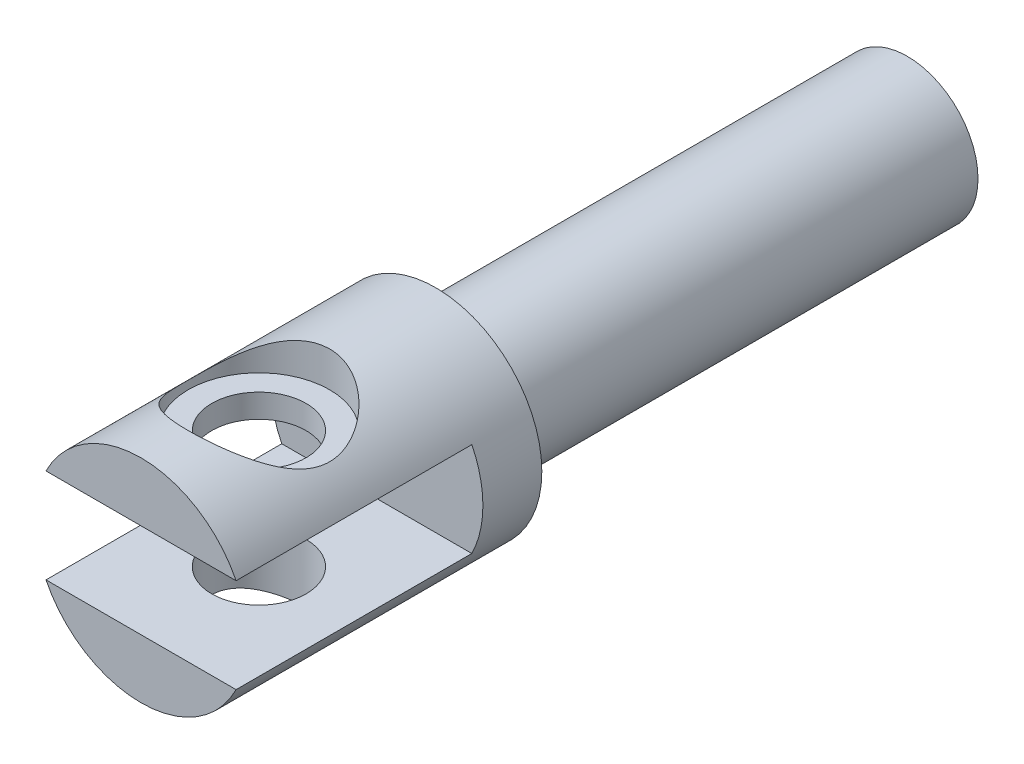
ISO-10303-21;
HEADER;
FILE_DESCRIPTION(('STEP AP214'),'2;1');
FILE_NAME('part.step','',(''),(''),'','','');
FILE_SCHEMA(('AUTOMOTIVE_DESIGN { 1 0 10303 214 1 1 1 1 }'));
ENDSEC;
DATA;
#1=APPLICATION_CONTEXT('core data for automotive mechanical design processes');
#2=APPLICATION_PROTOCOL_DEFINITION('international standard','automotive_design',2000,#1);
#3=PRODUCT_CONTEXT('',#1,'mechanical');
#4=PRODUCT('Part','Part','',(#3));
#5=PRODUCT_RELATED_PRODUCT_CATEGORY('part','',(#4));
#6=PRODUCT_DEFINITION_FORMATION('','',#4);
#7=PRODUCT_DEFINITION_CONTEXT('part definition',#1,'design');
#8=PRODUCT_DEFINITION('design','',#6,#7);
#9=PRODUCT_DEFINITION_SHAPE('','',#8);
#10=(LENGTH_UNIT() NAMED_UNIT(*) SI_UNIT(.MILLI.,.METRE.));
#11=(NAMED_UNIT(*) PLANE_ANGLE_UNIT() SI_UNIT($,.RADIAN.));
#12=(NAMED_UNIT(*) SI_UNIT($,.STERADIAN.) SOLID_ANGLE_UNIT());
#13=UNCERTAINTY_MEASURE_WITH_UNIT(LENGTH_MEASURE(1.E-05),#10,'distance_accuracy_value','');
#14=(GEOMETRIC_REPRESENTATION_CONTEXT(3) GLOBAL_UNCERTAINTY_ASSIGNED_CONTEXT((#13)) GLOBAL_UNIT_ASSIGNED_CONTEXT((#10,
#11,#12)) REPRESENTATION_CONTEXT('',''));
#15=CARTESIAN_POINT('',(0.,0.,0.));
#16=DIRECTION('',(0.,0.,1.));
#17=DIRECTION('',(1.,0.,0.));
#18=AXIS2_PLACEMENT_3D('',#15,#16,#17);
#19=CARTESIAN_POINT('',(0.,0.,44.4099510590377));
#20=DIRECTION('',(0.,0.,1.));
#21=DIRECTION('',(1.,0.,0.));
#22=AXIS2_PLACEMENT_3D('',#19,#20,#21);
#23=CYLINDRICAL_SURFACE('',#22,9.);
#24=CARTESIAN_POINT('',(0.,0.,0.));
#25=DIRECTION('',(0.,0.,1.));
#26=DIRECTION('',(1.,0.,0.));
#27=AXIS2_PLACEMENT_3D('',#24,#25,#26);
#28=CIRCLE('',#27,9.);
#29=CARTESIAN_POINT('',(9.,0.,0.));
#30=VERTEX_POINT('',#29);
#31=EDGE_CURVE('E96',#30,#30,#28,.T.);
#32=ORIENTED_EDGE('',*,*,#31,.T.);
#33=EDGE_LOOP('',(#32));
#34=FACE_BOUND('',#33,.T.);
#35=CARTESIAN_POINT('',(0.,0.,5.));
#36=DIRECTION('',(0.,0.,1.));
#37=DIRECTION('',(1.,0.,0.));
#38=AXIS2_PLACEMENT_3D('',#35,#36,#37);
#39=CIRCLE('',#38,9.);
#40=CARTESIAN_POINT('',(-8.06225774829855,4.,5.));
#41=VERTEX_POINT('',#40);
#42=CARTESIAN_POINT('',(-8.06225774829855,-4.,5.));
#43=VERTEX_POINT('',#42);
#44=EDGE_CURVE('E60',#41,#43,#39,.T.);
#45=ORIENTED_EDGE('',*,*,#44,.F.);
#46=DIRECTION('',(0.,0.,1.));
#47=VECTOR('',#46,1.);
#48=CARTESIAN_POINT('',(-8.06225774829854,4.,44.4099510590377));
#49=LINE('',#48,#47);
#50=CARTESIAN_POINT('',(-8.06225774829854,4.,25.));
#51=VERTEX_POINT('',#50);
#52=EDGE_CURVE('E48',#41,#51,#49,.T.);
#53=ORIENTED_EDGE('',*,*,#52,.T.);
#54=CARTESIAN_POINT('',(0.,0.,25.));
#55=DIRECTION('',(0.,0.,1.));
#56=DIRECTION('',(1.,0.,0.));
#57=AXIS2_PLACEMENT_3D('',#54,#55,#56);
#58=CIRCLE('',#57,9.);
#59=CARTESIAN_POINT('',(8.06225774829855,4.,25.));
#60=VERTEX_POINT('',#59);
#61=EDGE_CURVE('E95',#60,#51,#58,.T.);
#62=ORIENTED_EDGE('',*,*,#61,.F.);
#63=DIRECTION('',(0.,0.,1.));
#64=VECTOR('',#63,1.);
#65=CARTESIAN_POINT('',(8.06225774829855,4.,44.4099510590377));
#66=LINE('',#65,#64);
#67=CARTESIAN_POINT('',(8.06225774829855,4.,5.));
#68=VERTEX_POINT('',#67);
#69=EDGE_CURVE('E107',#60,#68,#66,.F.);
#70=ORIENTED_EDGE('',*,*,#69,.T.);
#71=CARTESIAN_POINT('',(8.06225774829855,-4.,5.));
#72=VERTEX_POINT('',#71);
#73=EDGE_CURVE('E99',#72,#68,#39,.T.);
#74=ORIENTED_EDGE('',*,*,#73,.F.);
#75=DIRECTION('',(0.,0.,1.));
#76=VECTOR('',#75,1.);
#77=CARTESIAN_POINT('',(8.06225774829855,-4.,44.4099510590377));
#78=LINE('',#77,#76);
#79=CARTESIAN_POINT('',(8.06225774829855,-4.,25.));
#80=VERTEX_POINT('',#79);
#81=EDGE_CURVE('E94',#72,#80,#78,.T.);
#82=ORIENTED_EDGE('',*,*,#81,.T.);
#83=CARTESIAN_POINT('',(-8.06225774829854,-4.,25.));
#84=VERTEX_POINT('',#83);
#85=EDGE_CURVE('E88',#84,#80,#58,.T.);
#86=ORIENTED_EDGE('',*,*,#85,.F.);
#87=DIRECTION('',(0.,0.,1.));
#88=VECTOR('',#87,1.);
#89=CARTESIAN_POINT('',(-8.06225774829854,-4.,44.4099510590377));
#90=LINE('',#89,#88);
#91=EDGE_CURVE('E78',#84,#43,#90,.F.);
#92=ORIENTED_EDGE('',*,*,#91,.T.);
#93=EDGE_LOOP('',(#45,#53,#62,#70,#74,#82,#86,#92));
#94=FACE_BOUND('',#93,.T.);
#95=CARTESIAN_POINT('',(0.,-9.,19.));
#96=CARTESIAN_POINT('',(0.106543560764115,-8.99999931236002,18.9999991633007));
#97=CARTESIAN_POINT('',(0.21311453593369,-8.99810295733528,18.995737372374));
#98=CARTESIAN_POINT('',(0.425487759472881,-8.99056534028924,18.9787335893494));
#99=CARTESIAN_POINT('',(0.531289533809613,-8.9849219391011,18.9659867531779));
#100=CARTESIAN_POINT('',(0.741497571680321,-8.97002203225641,18.9321151074332));
#101=CARTESIAN_POINT('',(0.845900846236377,-8.96075877099567,18.9109746319474));
#102=CARTESIAN_POINT('',(1.0523739381887,-8.93886560682324,18.8605472820358));
#103=CARTESIAN_POINT('',(1.15444278316294,-8.92623432770846,18.8312570773423));
#104=CARTESIAN_POINT('',(1.45528706477071,-8.88385509084484,18.731826836376));
#105=CARTESIAN_POINT('',(1.64969223818529,-8.84954694128078,18.6499645338792));
#106=CARTESIAN_POINT('',(2.02169397175996,-8.77205693690159,18.457842670196));
#107=CARTESIAN_POINT('',(2.19929435076136,-8.72887710525828,18.3475895820297));
#108=CARTESIAN_POINT('',(2.54295194306068,-8.63520005099137,18.095329590415));
#109=CARTESIAN_POINT('',(2.70796463469603,-8.58444255570291,17.951994251306));
#110=CARTESIAN_POINT('',(3.01251193717389,-8.48237167141423,17.6405139421417));
#111=CARTESIAN_POINT('',(3.15203136079603,-8.43105797021839,17.4723542905208));
#112=CARTESIAN_POINT('',(3.40970641309573,-8.33031613694453,17.1040790226803));
#113=CARTESIAN_POINT('',(3.52616342827006,-8.28116793674049,16.9026789235266));
#114=CARTESIAN_POINT('',(3.67379855799914,-8.21620901778825,16.5864416488202));
#115=CARTESIAN_POINT('',(3.71851343023117,-8.19601074422211,16.4786304220921));
#116=CARTESIAN_POINT('',(3.79849956446532,-8.15924882688405,16.2589808843342));
#117=CARTESIAN_POINT('',(3.83377590592702,-8.14268322901324,16.1471447762581));
#118=CARTESIAN_POINT('',(3.89288163397949,-8.11458487568386,15.9262099952243));
#119=CARTESIAN_POINT('',(3.91721191584564,-8.1028347628908,15.8172725732999));
#120=CARTESIAN_POINT('',(3.95670961203999,-8.08362129694743,15.5974216620398));
#121=CARTESIAN_POINT('',(3.9718814403629,-8.07615587883755,15.4865091511934));
#122=CARTESIAN_POINT('',(3.99287182782271,-8.06579894008708,15.2636277551766));
#123=CARTESIAN_POINT('',(3.99869365272533,-8.06290582244073,15.1516592525933));
#124=CARTESIAN_POINT('',(4.00091360303008,-8.06180452405908,14.9276108787127));
#125=CARTESIAN_POINT('',(3.99731233389618,-8.06359604232092,14.8155310150333));
#126=CARTESIAN_POINT('',(3.98148137626882,-8.07142338434779,14.6022728195278));
#127=CARTESIAN_POINT('',(3.97005575276389,-8.07706352800997,14.5010195378657));
#128=CARTESIAN_POINT('',(3.9395760613895,-8.09197245318636,14.2999289308257));
#129=CARTESIAN_POINT('',(3.92051952834525,-8.10124240729389,14.2000920738277));
#130=CARTESIAN_POINT('',(3.85217674750056,-8.13408651281412,13.9037623707013));
#131=CARTESIAN_POINT('',(3.79170447177769,-8.16270181226473,13.7102821219667));
#132=CARTESIAN_POINT('',(3.64150006667489,-8.23081734439647,13.3321015103139));
#133=CARTESIAN_POINT('',(3.5511416190136,-8.2705474900895,13.1476957129476));
#134=CARTESIAN_POINT('',(3.34416344596326,-8.35638151227701,12.7958565713623));
#135=CARTESIAN_POINT('',(3.22753266369898,-8.40248806916055,12.6284304162798));
#136=CARTESIAN_POINT('',(2.95801583387873,-8.50133279495595,12.2981702205771));
#137=CARTESIAN_POINT('',(2.80270476501177,-8.55427944513663,12.1373723519805));
#138=CARTESIAN_POINT('',(2.46687651443058,-8.65709798777378,11.8433658042786));
#139=CARTESIAN_POINT('',(2.28635173983005,-8.70696894746715,11.7101654660466));
#140=CARTESIAN_POINT('',(1.89830549192186,-8.79984898075653,11.4715733510371));
#141=CARTESIAN_POINT('',(1.69014406889665,-8.84261183911195,11.3671192609486));
#142=CARTESIAN_POINT('',(1.25681485203023,-8.91451161297059,11.1954461528071));
#143=CARTESIAN_POINT('',(1.03165788152718,-8.94365711683337,11.1282036607389));
#144=CARTESIAN_POINT('',(0.587641070885756,-8.98336516942802,11.0373762186451));
#145=CARTESIAN_POINT('',(0.369442331131813,-8.99508492412832,11.0110665893289));
#146=CARTESIAN_POINT('',(-0.0685540826286693,-9.00240007523686,10.994593770026));
#147=CARTESIAN_POINT('',(-0.288351188214386,-8.9980009485081,11.0044183024018));
#148=CARTESIAN_POINT('',(-0.709814814369031,-8.97430591809511,11.0580870995178));
#149=CARTESIAN_POINT('',(-0.911792765731199,-8.95589038121198,11.0999216213306));
#150=CARTESIAN_POINT('',(-1.30558421565956,-8.90701082021956,11.2135161219344));
#151=CARTESIAN_POINT('',(-1.49739647572632,-8.87654533185795,11.2852797376229));
#152=CARTESIAN_POINT('',(-1.87220783588443,-8.80524764691282,11.4589771367205));
#153=CARTESIAN_POINT('',(-2.05474529218523,-8.76412168349642,11.5617823167402));
#154=CARTESIAN_POINT('',(-2.40063957243038,-8.67576208193101,11.7937052305615));
#155=CARTESIAN_POINT('',(-2.56398799395825,-8.62852578709614,11.9228344238206));
#156=CARTESIAN_POINT('',(-2.88073032703291,-8.52825739375591,12.2158239557748));
#157=CARTESIAN_POINT('',(-3.03226090719451,-8.4750650088176,12.3816446889973));
#158=CARTESIAN_POINT('',(-3.30602071854252,-8.37207677010346,12.7371478797539));
#159=CARTESIAN_POINT('',(-3.42823956174355,-8.32228212493563,12.9268387605861));
#160=CARTESIAN_POINT('',(-3.58807434164479,-8.25404075216361,13.228245445123));
#161=CARTESIAN_POINT('',(-3.63788387634673,-8.23214803707208,13.3328797329325));
#162=CARTESIAN_POINT('',(-3.72840991291049,-8.19154569522209,13.5465889296407));
#163=CARTESIAN_POINT('',(-3.76913049781947,-8.17283464006355,13.6556618184356));
#164=CARTESIAN_POINT('',(-3.84101557494808,-8.13929816800194,13.8774217357218));
#165=CARTESIAN_POINT('',(-3.87218560166711,-8.12447050142149,13.9901066290918));
#166=CARTESIAN_POINT('',(-3.92460929100956,-8.09927719768151,14.2182490415586));
#167=CARTESIAN_POINT('',(-3.94586407399639,-8.08891105640648,14.3337062458499));
#168=CARTESIAN_POINT('',(-3.9767877017106,-8.07374935283999,14.5564793533286));
#169=CARTESIAN_POINT('',(-3.98728755575061,-8.06855529639578,14.6636534195266));
#170=CARTESIAN_POINT('',(-3.99960939260381,-8.06245450280348,14.8786598561397));
#171=CARTESIAN_POINT('',(-4.00142848498409,-8.06154919368018,14.9864924338545));
#172=CARTESIAN_POINT('',(-3.99635429337704,-8.06406616285806,15.2018440734693));
#173=CARTESIAN_POINT('',(-3.98946605490684,-8.06748593496455,15.3093632807811));
#174=CARTESIAN_POINT('',(-3.96708318300727,-8.07851431964463,15.5232976584552));
#175=CARTESIAN_POINT('',(-3.95158530941064,-8.08612450923878,15.6297123977913));
#176=CARTESIAN_POINT('',(-3.89481025673449,-8.11370655018846,15.9332533476483));
#177=CARTESIAN_POINT('',(-3.84284512159463,-8.13866591875024,16.1280439392264));
#178=CARTESIAN_POINT('',(-3.71108221021498,-8.19957700487955,16.5059989470962));
#179=CARTESIAN_POINT('',(-3.63127638750922,-8.23553189998354,16.6891599841257));
#180=CARTESIAN_POINT('',(-3.44024324515819,-8.31722161393653,17.051664709865));
#181=CARTESIAN_POINT('',(-3.32733013865014,-8.36343549057003,17.2300116789176));
#182=CARTESIAN_POINT('',(-3.0754694656553,-8.45929191031224,17.5662532488446));
#183=CARTESIAN_POINT('',(-2.93651102511199,-8.50893588001619,17.7241392604289));
#184=CARTESIAN_POINT('',(-2.62217220790801,-8.61126362572534,18.0292405024539));
#185=CARTESIAN_POINT('',(-2.44466910724623,-8.66383343564896,18.1743141573913));
#186=CARTESIAN_POINT('',(-2.06586629934031,-8.76186799200868,18.4328842090144));
#187=CARTESIAN_POINT('',(-1.86455578078997,-8.80732948852386,18.546366180379));
#188=CARTESIAN_POINT('',(-1.55009155680925,-8.86614466582397,18.6892195454876));
#189=CARTESIAN_POINT('',(-1.4437611556819,-8.88411858212818,18.732125172321));
#190=CARTESIAN_POINT('',(-1.22735110682473,-8.91658812616538,18.8087739322013));
#191=CARTESIAN_POINT('',(-1.11727329280022,-8.93108542793378,18.8425214760194));
#192=CARTESIAN_POINT('',(-0.89447500471606,-8.95614098674219,18.9004023143905));
#193=CARTESIAN_POINT('',(-0.781761539000783,-8.96670865291079,18.9245585838433));
#194=CARTESIAN_POINT('',(-0.55441464300775,-8.9836293170273,18.9630667387991));
#195=CARTESIAN_POINT('',(-0.439782603478103,-8.98998524296698,18.9774254357579));
#196=CARTESIAN_POINT('',(-0.270722867755124,-8.99608997508148,18.99119614917));
#197=CARTESIAN_POINT('',(-0.216644660495976,-8.99755504734627,18.994496278881));
#198=CARTESIAN_POINT('',(-0.108380000601332,-8.99951024035253,18.9988984298566));
#199=CARTESIAN_POINT('',(-0.0541935467157933,-9.00000034976913,19.0000004255884));
#200=CARTESIAN_POINT('',(0.,-9.,19.));
#201=B_SPLINE_CURVE_WITH_KNOTS('',3,(#95,#96,#97,#98,#99,#100,#101,#102,#103,#104,#105,#106,
#107,#108,#109,#110,#111,#112,#113,#114,#115,#116,#117,#118,#119,#120,#121,#122,#123,#124,#125,
#126,#127,#128,#129,#130,#131,#132,#133,#134,#135,#136,#137,#138,#139,#140,#141,#142,#143,#144,
#145,#146,#147,#148,#149,#150,#151,#152,#153,#154,#155,#156,#157,#158,#159,#160,#161,#162,#163,
#164,#165,#166,#167,#168,#169,#170,#171,#172,#173,#174,#175,#176,#177,#178,#179,#180,#181,#182,
#183,#184,#185,#186,#187,#188,#189,#190,#191,#192,#193,#194,#195,#196,#197,#198,#199,#200),
.UNSPECIFIED.,.T.,.F.,(4,2,2,2,2,2,2,2,2,2,2,2,2,2,2,2,2,2,2,2,2,2,2,2,2,2,2,2,2,2,2,2,2,2,2,2,
2,2,2,2,2,2,2,2,2,2,2,2,2,2,2,2,4),(0.,0.319575995494491,0.639334592113709,0.959692813851972,
1.28018213803926,1.91817504615677,2.55602262225846,3.22626867716013,3.89691272815776,
4.6062783907758,4.96122462740457,5.31597945944821,5.65223953951962,5.9883374265179,
6.32431789582033,6.66027677783181,6.96605959233536,7.27194127015288,7.88320420131182,
8.50818797600341,9.13343527205269,9.81959120458711,10.5059542142737,11.2125921876432,
11.9187838863229,12.5755805291255,13.2321540266912,13.8505799936734,14.4690811319117,
15.1068781804635,15.7449534721389,16.4344546029635,17.1241997308767,17.4776093864017,
17.8308599580232,18.1839054338953,18.5369110080658,18.8599212751303,19.183039087411,
19.5059697528593,19.8290220330897,20.4355356034002,21.042224612609,21.6877902452578,
22.3336260075754,23.0359566714551,23.7386075078666,24.0863996614848,24.4340240108549,
24.7808105646473,25.1273557796159,25.2899067151077,25.4524595387309),.UNSPECIFIED.);
#202=CARTESIAN_POINT('',(0.,-9.,19.));
#203=VERTEX_POINT('',#202);
#204=EDGE_CURVE('E90',#203,#203,#201,.T.);
#205=ORIENTED_EDGE('',*,*,#204,.T.);
#206=EDGE_LOOP('',(#205));
#207=FACE_BOUND('',#206,.T.);
#208=CARTESIAN_POINT('',(0.,9.,9.00000000000001));
#209=CARTESIAN_POINT('',(-0.15072962230584,8.99999995585147,9.00000004400444));
#210=CARTESIAN_POINT('',(-0.301460005061743,8.9962053679738,9.00568745268412));
#211=CARTESIAN_POINT('',(-0.601688556515667,8.98112265027611,9.02834736786867));
#212=CARTESIAN_POINT('',(-0.751186718723969,8.96983448101525,9.04531993377052));
#213=CARTESIAN_POINT('',(-1.04780606417449,8.94004058807467,9.09029533806845));
#214=CARTESIAN_POINT('',(-1.19492680669761,8.92153354180874,9.11830019772453));
#215=CARTESIAN_POINT('',(-1.48576112693976,8.87773364005912,9.18495186917267));
#216=CARTESIAN_POINT('',(-1.6294732281757,8.85243790037608,9.22360320434032));
#217=CARTESIAN_POINT('',(-1.91177872558018,8.79577830450418,9.31081633812479));
#218=CARTESIAN_POINT('',(-2.05039477937361,8.76444655793924,9.35932576663352));
#219=CARTESIAN_POINT('',(-2.32256233058593,8.69628785219886,9.46582541405066));
#220=CARTESIAN_POINT('',(-2.45611182989862,8.659458752704,9.52381932645843));
#221=CARTESIAN_POINT('',(-2.84809658114957,8.54181392713049,9.71113509857054));
#222=CARTESIAN_POINT('',(-3.09811195500101,8.45378981932179,9.85386752897524));
#223=CARTESIAN_POINT('',(-3.59189330885235,8.25681534514022,10.1839818016208));
#224=CARTESIAN_POINT('',(-3.83332869268148,8.1467230749831,10.3741246853751));
#225=CARTESIAN_POINT('',(-4.28319637469338,7.91945321886923,10.7872090694635));
#226=CARTESIAN_POINT('',(-4.49158048555778,7.80226562576429,11.0101975607816));
#227=CARTESIAN_POINT('',(-4.79239457135194,7.61903553612194,11.3855757070695));
#228=CARTESIAN_POINT('',(-4.89672662856444,7.55221574084949,11.5282033774588));
#229=CARTESIAN_POINT('',(-5.09292728943464,7.42132140336272,11.8229760792322));
#230=CARTESIAN_POINT('',(-5.18479306305094,7.35724748675707,11.9751232602786));
#231=CARTESIAN_POINT('',(-5.44039994615965,7.17258665154311,12.4448512458896));
#232=CARTESIAN_POINT('',(-5.58476240011456,7.05916900886957,12.7764768225185));
#233=CARTESIAN_POINT('',(-5.78024082559467,6.89928079390125,13.3702209272022));
#234=CARTESIAN_POINT('',(-5.84624506230703,6.84293565925667,13.6247624258584));
#235=CARTESIAN_POINT('',(-5.91998570312693,6.77899474935292,14.0144670565937));
#236=CARTESIAN_POINT('',(-5.94035188146208,6.76111360358516,14.1456302775786));
#237=CARTESIAN_POINT('',(-5.97238672990613,6.7328353656429,14.4098425412755));
#238=CARTESIAN_POINT('',(-5.98405535234979,6.72243831448353,14.5428915943186));
#239=CARTESIAN_POINT('',(-5.9985061575997,6.70954663359649,14.8104091004435));
#240=CARTESIAN_POINT('',(-6.00125134141577,6.70708490621809,14.944881149757));
#241=CARTESIAN_POINT('',(-5.99770198955945,6.71025905496978,15.2136084747827));
#242=CARTESIAN_POINT('',(-5.99140742318069,6.71589495860601,15.3478637497569));
#243=CARTESIAN_POINT('',(-5.96988769246357,6.73503137215893,15.6151622921933));
#244=CARTESIAN_POINT('',(-5.95465768785753,6.74853614456245,15.7482048630445));
#245=CARTESIAN_POINT('',(-5.91553265422359,6.78285629118457,16.0120738835517));
#246=CARTESIAN_POINT('',(-5.89163397696998,6.80367474326149,16.1428993758463));
#247=CARTESIAN_POINT('',(-5.80996444024941,6.87381692297077,16.5192414797259));
#248=CARTESIAN_POINT('',(-5.74115656052929,6.93184442552377,16.7608395518519));
#249=CARTESIAN_POINT('',(-5.576098338457,7.06528890582515,17.2291155449497));
#250=CARTESIAN_POINT('',(-5.47983896595979,7.14071160414418,17.4557885260749));
#251=CARTESIAN_POINT('',(-5.24022208796981,7.31892320954064,17.9370543618435));
#252=CARTESIAN_POINT('',(-5.09126717645732,7.42415802950435,18.1879479300109));
#253=CARTESIAN_POINT('',(-4.76004317394309,7.64075764898377,18.6641819967));
#254=CARTESIAN_POINT('',(-4.57773299424651,7.75212988931613,18.8894904171697));
#255=CARTESIAN_POINT('',(-4.2596291871296,7.92935002667426,19.2292471886765));
#256=CARTESIAN_POINT('',(-4.13357696363754,7.99594629678863,19.3525572265687));
#257=CARTESIAN_POINT('',(-3.87038124621711,8.12660477277741,19.588172776184));
#258=CARTESIAN_POINT('',(-3.73324106763127,8.19066772765439,19.7004815552778));
#259=CARTESIAN_POINT('',(-3.44840396167413,8.31460339064873,19.9132572967762));
#260=CARTESIAN_POINT('',(-3.30071231639898,8.37447816608009,20.0137301184868));
#261=CARTESIAN_POINT('',(-2.99534256192433,8.48848992914058,20.2019290858995));
#262=CARTESIAN_POINT('',(-2.83766721772878,8.54262849441554,20.2896587388658));
#263=CARTESIAN_POINT('',(-2.54499814107463,8.63375113458629,20.4354600462134));
#264=CARTESIAN_POINT('',(-2.41161567122491,8.67201774379612,20.495974494037));
#265=CARTESIAN_POINT('',(-2.13954321931416,8.74311799376199,20.6074913052871));
#266=CARTESIAN_POINT('',(-2.00085431903204,8.77595273467916,20.658495595151));
#267=CARTESIAN_POINT('',(-1.7189768136733,8.83548832961117,20.7503981442406));
#268=CARTESIAN_POINT('',(-1.57579110331514,8.86219304127522,20.7913027604596));
#269=CARTESIAN_POINT('',(-1.28572629859262,8.90889916372291,20.8625257159909));
#270=CARTESIAN_POINT('',(-1.1388471474499,8.92890047138895,20.8928438924538));
#271=CARTESIAN_POINT('',(-0.841791942137035,8.96179736848291,20.9425719941902));
#272=CARTESIAN_POINT('',(-0.691604277461504,8.97466149510724,20.9619336271446));
#273=CARTESIAN_POINT('',(-0.389735976642171,8.99282868173345,20.9892463671011));
#274=CARTESIAN_POINT('',(-0.238055338547811,8.99813173185554,20.9971974591934));
#275=CARTESIAN_POINT('',(0.0655394290023677,9.00104153419543,21.0015624042721));
#276=CARTESIAN_POINT('',(0.217453548576566,8.9986486036265,20.9979767327814));
#277=CARTESIAN_POINT('',(0.520254440302976,8.98622801322276,20.9793262575945));
#278=CARTESIAN_POINT('',(0.67114125602537,8.97620067924044,20.964261943831));
#279=CARTESIAN_POINT('',(0.960099063451868,8.94973490388406,20.9243531158226));
#280=CARTESIAN_POINT('',(1.09832305580766,8.93379881037893,20.9002737800015));
#281=CARTESIAN_POINT('',(1.3719963654424,8.89588211668836,20.8427037794022));
#282=CARTESIAN_POINT('',(1.50744472377709,8.87389946410454,20.8092099189442));
#283=CARTESIAN_POINT('',(1.77469424179231,8.82433671407073,20.7332146018061));
#284=CARTESIAN_POINT('',(1.9064964787877,8.7967582905098,20.6907158386366));
#285=CARTESIAN_POINT('',(2.16585095360263,8.73652395830709,20.597153154648));
#286=CARTESIAN_POINT('',(2.29340153573781,8.70386609903954,20.546085942742));
#287=CARTESIAN_POINT('',(2.68384568582263,8.59491911826369,20.3740940632886));
#288=CARTESIAN_POINT('',(2.93844728759674,8.51070479139785,20.2389512371071));
#289=CARTESIAN_POINT('',(3.42209036372164,8.3280469756418,19.9366844210874));
#290=CARTESIAN_POINT('',(3.65111591352084,8.22959470828606,19.7695406801995));
#291=CARTESIAN_POINT('',(4.11554429130499,8.00864358445329,19.3781901057186));
#292=CARTESIAN_POINT('',(4.34622868572374,7.88480405646165,19.1491393264828));
#293=CARTESIAN_POINT('',(4.76804600199325,7.63711582679967,18.6566275771877));
#294=CARTESIAN_POINT('',(4.95915158704088,7.51326717750207,18.3931430274857));
#295=CARTESIAN_POINT('',(5.20616918569024,7.34198751964739,17.986324484545));
#296=CARTESIAN_POINT('',(5.27921697702155,7.28951977901591,17.855269318415));
#297=CARTESIAN_POINT('',(5.41584589984557,7.18858887021073,17.5867551265017));
#298=CARTESIAN_POINT('',(5.47942590699139,7.14012617796026,17.4492953426787));
#299=CARTESIAN_POINT('',(5.59646403292411,7.04876602779047,17.1685680243391));
#300=CARTESIAN_POINT('',(5.6499354633632,7.0058612745874,17.0253084337204));
#301=CARTESIAN_POINT('',(5.74620164834172,6.9271232919649,16.7334225966496));
#302=CARTESIAN_POINT('',(5.78900316794111,6.89128558484321,16.5847998194153));
#303=CARTESIAN_POINT('',(5.85661826485719,6.83385842215742,16.3100711601695));
#304=CARTESIAN_POINT('',(5.88328161294609,6.81086609963068,16.1847122854631));
#305=CARTESIAN_POINT('',(5.92862999751557,6.77142914495134,15.9315920680806));
#306=CARTESIAN_POINT('',(5.94731901928204,6.75498124240744,15.8038319588671));
#307=CARTESIAN_POINT('',(5.97643608474823,6.72923413020983,15.5467472616927));
#308=CARTESIAN_POINT('',(5.9868701778931,6.71992968577619,15.4174238900303));
#309=CARTESIAN_POINT('',(5.99932331015653,6.70881432384084,15.158046063199));
#310=CARTESIAN_POINT('',(6.00134222646471,6.70700351570064,15.0279915973883));
#311=CARTESIAN_POINT('',(5.99692459405668,6.71095435083986,14.7680640426268));
#312=CARTESIAN_POINT('',(5.99048321844489,6.71672031693769,14.6381910995738));
#313=CARTESIAN_POINT('',(5.96925971270465,6.73558614063362,14.3796943345649));
#314=CARTESIAN_POINT('',(5.9544776509522,6.74868593810979,14.2510705023778));
#315=CARTESIAN_POINT('',(5.8979128416254,6.79832833535244,13.8681352874178));
#316=CARTESIAN_POINT('',(5.84391363215309,6.84521161664421,13.6168707087679));
#317=CARTESIAN_POINT('',(5.68777703693194,6.97580808966408,13.0627729119847));
#318=CARTESIAN_POINT('',(5.57664669562184,7.0660062540569,12.7640389514539));
#319=CARTESIAN_POINT('',(5.37860347419034,7.21647622558034,12.3362736912396));
#320=CARTESIAN_POINT('',(5.30726989328923,7.26922722643008,12.1969343324222));
#321=CARTESIAN_POINT('',(5.15463975845799,7.37824513022701,11.9252730172202));
#322=CARTESIAN_POINT('',(5.07334373068852,7.43451184741689,11.7929506907636));
#323=CARTESIAN_POINT('',(4.81201502443458,7.60845890956525,11.4022431556306));
#324=CARTESIAN_POINT('',(4.61687265696578,7.72943088955528,11.1551222100802));
#325=CARTESIAN_POINT('',(4.29684026033748,7.90899770516148,10.8093119362579));
#326=CARTESIAN_POINT('',(4.18555156787558,7.96856536389415,10.6981411557233));
#327=CARTESIAN_POINT('',(3.95402212651261,8.0859461536042,10.4844136320828));
#328=CARTESIAN_POINT('',(3.83378004004315,8.14375902060586,10.3818581809311));
#329=CARTESIAN_POINT('',(3.56674436267309,8.26455070132618,10.1718324423243));
#330=CARTESIAN_POINT('',(3.41862163544369,8.32707326839166,10.0657838709166));
#331=CARTESIAN_POINT('',(3.11179261111765,8.44652770995564,9.86675916203939));
#332=CARTESIAN_POINT('',(2.95309094593358,8.50346200459069,9.77377735809046));
#333=CARTESIAN_POINT('',(2.62603732034734,8.61008023006582,9.6020366578859));
#334=CARTESIAN_POINT('',(2.45769464324868,8.65977097748361,9.52326437289027));
#335=CARTESIAN_POINT('',(2.11241130934653,8.75040224410029,9.38105486372839));
#336=CARTESIAN_POINT('',(1.93547369822181,8.79134583555446,9.31761225430558));
#337=CARTESIAN_POINT('',(1.61466512300621,8.85513177713006,9.21947960090383));
#338=CARTESIAN_POINT('',(1.47217899361133,8.87997472899837,9.18153312409536));
#339=CARTESIAN_POINT('',(1.18384942742967,8.92298887352277,9.11609476459829));
#340=CARTESIAN_POINT('',(1.03800668802834,8.94116143898747,9.08860073068776));
#341=CARTESIAN_POINT('',(0.744070656079112,8.97040466661752,9.04446199171462));
#342=CARTESIAN_POINT('',(0.59597875459169,8.98147954900223,9.02781083947598));
#343=CARTESIAN_POINT('',(0.298591514040661,8.99627737544156,9.00557961419041));
#344=CARTESIAN_POINT('',(0.149296130047602,9.00000004372866,8.99999995641407));
#345=CARTESIAN_POINT('',(0.,9.,9.00000000000001));
#346=B_SPLINE_CURVE_WITH_KNOTS('',3,(#208,#209,#210,#211,#212,#213,#214,#215,#216,#217,#218,
#219,#220,#221,#222,#223,#224,#225,#226,#227,#228,#229,#230,#231,#232,#233,#234,#235,#236,#237,
#238,#239,#240,#241,#242,#243,#244,#245,#246,#247,#248,#249,#250,#251,#252,#253,#254,#255,#256,
#257,#258,#259,#260,#261,#262,#263,#264,#265,#266,#267,#268,#269,#270,#271,#272,#273,#274,#275,
#276,#277,#278,#279,#280,#281,#282,#283,#284,#285,#286,#287,#288,#289,#290,#291,#292,#293,#294,
#295,#296,#297,#298,#299,#300,#301,#302,#303,#304,#305,#306,#307,#308,#309,#310,#311,#312,#313,
#314,#315,#316,#317,#318,#319,#320,#321,#322,#323,#324,#325,#326,#327,#328,#329,#330,#331,#332,
#333,#334,#335,#336,#337,#338,#339,#340,#341,#342,#343,#344,#345),.UNSPECIFIED.,.T.,.F.,(4,2,2,
2,2,2,2,2,2,2,2,2,2,2,2,2,2,2,2,2,2,2,2,2,2,2,2,2,2,2,2,2,2,2,2,2,2,2,2,2,2,2,2,2,2,2,2,2,2,2,2,
2,2,2,2,2,2,2,2,2,2,2,2,2,2,2,2,2,4),(0.,0.452036580111443,0.904075539438481,1.35619735674,
1.80851156444627,2.25848292496265,2.70862993486738,3.60815079131828,4.58400234529207,
5.56126382339349,6.12742047182466,6.6937054324238,7.8231640969075,8.62651574382521,
9.02787251895182,9.42923149361959,9.83225250256988,10.235274880511,10.6385157748351,
11.0419265710542,11.8122805192037,12.5828881675017,13.5102418931756,14.4387457667511,
15.0036483176992,15.5683825808065,16.1328360908595,16.6971339525006,17.1508351664973,
17.6044443758377,18.0577673398902,18.5110972770303,18.9664100624721,19.4217234428555,
19.8770180563533,20.3322932380041,20.7554408923732,21.1787323544094,21.6018973814774,
22.0252253171915,22.9223330679289,23.8199963113995,24.8596079472821,25.8999352583161,
26.3764167766424,26.8529548344919,27.3288609157664,27.804464485721,28.1946952569021,
28.5847307754859,28.9744801995659,29.3642353115958,29.7542128893159,30.1441872700904,
30.924463377126,31.9126539226798,32.4078257816576,32.9029714996923,33.9105674544882,
34.4148344031001,34.9191768370557,35.4962031918118,36.0729785384256,36.6492075542345,
37.225233847725,37.673313493046,38.1213008689068,38.5690216277127,39.016759179351),.UNSPECIFIED.);
#347=CARTESIAN_POINT('',(0.,9.,9.00000000000001));
#348=VERTEX_POINT('',#347);
#349=EDGE_CURVE('E11',#348,#348,#346,.T.);
#350=ORIENTED_EDGE('',*,*,#349,.F.);
#351=EDGE_LOOP('',(#350));
#352=FACE_BOUND('',#351,.T.);
#353=ADVANCED_FACE('F36',(#34,#94,#207,#352),#23,.T.);
#354=CARTESIAN_POINT('',(0.,-9.,15.));
#355=DIRECTION('',(0.,1.,0.));
#356=DIRECTION('',(0.,0.,1.));
#357=AXIS2_PLACEMENT_3D('',#354,#355,#356);
#358=CYLINDRICAL_SURFACE('',#357,4.);
#359=CARTESIAN_POINT('',(0.,4.,15.));
#360=DIRECTION('',(0.,1.,0.));
#361=DIRECTION('',(0.,0.,1.));
#362=AXIS2_PLACEMENT_3D('',#359,#360,#361);
#363=CIRCLE('',#362,4.);
#364=CARTESIAN_POINT('',(0.,4.,19.));
#365=VERTEX_POINT('',#364);
#366=EDGE_CURVE('E113',#365,#365,#363,.T.);
#367=ORIENTED_EDGE('',*,*,#366,.F.);
#368=EDGE_LOOP('',(#367));
#369=FACE_BOUND('',#368,.T.);
#370=CARTESIAN_POINT('',(0.,6.,15.));
#371=DIRECTION('',(0.,1.,0.));
#372=DIRECTION('',(0.,0.,1.));
#373=AXIS2_PLACEMENT_3D('',#370,#371,#372);
#374=CIRCLE('',#373,4.);
#375=CARTESIAN_POINT('',(0.,6.,19.));
#376=VERTEX_POINT('',#375);
#377=EDGE_CURVE('E120',#376,#376,#374,.T.);
#378=ORIENTED_EDGE('',*,*,#377,.T.);
#379=EDGE_LOOP('',(#378));
#380=FACE_BOUND('',#379,.T.);
#381=ADVANCED_FACE('F143',(#369,#380),#358,.F.);
#382=CARTESIAN_POINT('',(0.,0.,25.));
#383=DIRECTION('',(0.,0.,1.));
#384=DIRECTION('',(1.,0.,0.));
#385=AXIS2_PLACEMENT_3D('',#382,#383,#384);
#386=PLANE('',#385);
#387=DIRECTION('',(-1.,0.,0.));
#388=VECTOR('',#387,1.);
#389=CARTESIAN_POINT('',(-9.,4.,25.));
#390=LINE('',#389,#388);
#391=EDGE_CURVE('E89',#60,#51,#390,.T.);
#392=ORIENTED_EDGE('',*,*,#391,.F.);
#393=ORIENTED_EDGE('',*,*,#61,.T.);
#394=EDGE_LOOP('',(#392,#393));
#395=FACE_BOUND('',#394,.T.);
#396=ADVANCED_FACE('F167',(#395),#386,.T.);
#397=DIRECTION('',(1.,0.,0.));
#398=VECTOR('',#397,1.);
#399=CARTESIAN_POINT('',(-9.,-4.,25.));
#400=LINE('',#399,#398);
#401=EDGE_CURVE('E81',#84,#80,#400,.T.);
#402=ORIENTED_EDGE('',*,*,#401,.F.);
#403=ORIENTED_EDGE('',*,*,#85,.T.);
#404=EDGE_LOOP('',(#402,#403));
#405=FACE_BOUND('',#404,.T.);
#406=ADVANCED_FACE('F38',(#405),#386,.T.);
#407=CARTESIAN_POINT('',(0.,0.,0.));
#408=DIRECTION('',(0.,0.,1.));
#409=DIRECTION('',(1.,0.,0.));
#410=AXIS2_PLACEMENT_3D('',#407,#408,#409);
#411=PLANE('',#410);
#412=ORIENTED_EDGE('',*,*,#31,.F.);
#413=EDGE_LOOP('',(#412));
#414=FACE_BOUND('',#413,.T.);
#415=CARTESIAN_POINT('',(0.,0.,0.));
#416=DIRECTION('',(0.,0.,1.));
#417=DIRECTION('',(1.,0.,0.));
#418=AXIS2_PLACEMENT_3D('',#415,#416,#417);
#419=CIRCLE('',#418,5.99999999999999);
#420=CARTESIAN_POINT('',(6.,0.,0.));
#421=VERTEX_POINT('',#420);
#422=EDGE_CURVE('E101',#421,#421,#419,.T.);
#423=ORIENTED_EDGE('',*,*,#422,.T.);
#424=EDGE_LOOP('',(#423));
#425=FACE_BOUND('',#424,.T.);
#426=ADVANCED_FACE('F160',(#414,#425),#411,.F.);
#427=CARTESIAN_POINT('',(0.,0.,44.4099510590377));
#428=DIRECTION('',(0.,0.,1.));
#429=DIRECTION('',(1.,0.,0.));
#430=AXIS2_PLACEMENT_3D('',#427,#428,#429);
#431=CYLINDRICAL_SURFACE('',#430,5.99999999999999);
#432=ORIENTED_EDGE('',*,*,#422,.F.);
#433=EDGE_LOOP('',(#432));
#434=FACE_BOUND('',#433,.T.);
#435=CARTESIAN_POINT('',(0.,0.,-40.));
#436=DIRECTION('',(0.,0.,1.));
#437=DIRECTION('',(1.,0.,0.));
#438=AXIS2_PLACEMENT_3D('',#435,#436,#437);
#439=CIRCLE('',#438,5.99999999999999);
#440=CARTESIAN_POINT('',(5.99999999999999,0.,-40.));
#441=VERTEX_POINT('',#440);
#442=EDGE_CURVE('E271',#441,#441,#439,.T.);
#443=ORIENTED_EDGE('',*,*,#442,.T.);
#444=EDGE_LOOP('',(#443));
#445=FACE_BOUND('',#444,.T.);
#446=ADVANCED_FACE('F157',(#434,#445),#431,.T.);
#447=CARTESIAN_POINT('',(0.,0.,-40.));
#448=DIRECTION('',(0.,0.,1.));
#449=DIRECTION('',(1.,0.,0.));
#450=AXIS2_PLACEMENT_3D('',#447,#448,#449);
#451=PLANE('',#450);
#452=ORIENTED_EDGE('',*,*,#442,.F.);
#453=EDGE_LOOP('',(#452));
#454=FACE_BOUND('',#453,.T.);
#455=ADVANCED_FACE('F151',(#454),#451,.F.);
#456=CARTESIAN_POINT('',(-9.,4.,5.));
#457=DIRECTION('',(0.,1.,0.));
#458=DIRECTION('',(0.,0.,1.));
#459=AXIS2_PLACEMENT_3D('',#456,#457,#458);
#460=PLANE('',#459);
#461=ORIENTED_EDGE('',*,*,#366,.T.);
#462=EDGE_LOOP('',(#461));
#463=FACE_BOUND('',#462,.T.);
#464=DIRECTION('',(-1.,0.,0.));
#465=VECTOR('',#464,1.);
#466=CARTESIAN_POINT('',(-9.,4.,5.));
#467=LINE('',#466,#465);
#468=EDGE_CURVE('E269',#68,#41,#467,.T.);
#469=ORIENTED_EDGE('',*,*,#468,.F.);
#470=ORIENTED_EDGE('',*,*,#69,.F.);
#471=ORIENTED_EDGE('',*,*,#391,.T.);
#472=ORIENTED_EDGE('',*,*,#52,.F.);
#473=EDGE_LOOP('',(#469,#470,#471,#472));
#474=FACE_BOUND('',#473,.T.);
#475=ADVANCED_FACE('F148',(#463,#474),#460,.F.);
#476=CARTESIAN_POINT('',(-9.,-4.,5.));
#477=DIRECTION('',(0.,-1.,0.));
#478=DIRECTION('',(0.,0.,-1.));
#479=AXIS2_PLACEMENT_3D('',#476,#477,#478);
#480=PLANE('',#479);
#481=CARTESIAN_POINT('',(0.,-4.,15.));
#482=DIRECTION('',(0.,-1.,0.));
#483=DIRECTION('',(0.,0.,-1.));
#484=AXIS2_PLACEMENT_3D('',#481,#482,#483);
#485=CIRCLE('',#484,4.);
#486=CARTESIAN_POINT('',(0.,-4.,11.));
#487=VERTEX_POINT('',#486);
#488=EDGE_CURVE('E111',#487,#487,#485,.T.);
#489=ORIENTED_EDGE('',*,*,#488,.T.);
#490=EDGE_LOOP('',(#489));
#491=FACE_BOUND('',#490,.T.);
#492=DIRECTION('',(1.,0.,0.));
#493=VECTOR('',#492,1.);
#494=CARTESIAN_POINT('',(-9.,-4.,5.));
#495=LINE('',#494,#493);
#496=EDGE_CURVE('E55',#43,#72,#495,.T.);
#497=ORIENTED_EDGE('',*,*,#496,.F.);
#498=ORIENTED_EDGE('',*,*,#91,.F.);
#499=ORIENTED_EDGE('',*,*,#401,.T.);
#500=ORIENTED_EDGE('',*,*,#81,.F.);
#501=EDGE_LOOP('',(#497,#498,#499,#500));
#502=FACE_BOUND('',#501,.T.);
#503=ADVANCED_FACE('F80',(#491,#502),#480,.F.);
#504=CARTESIAN_POINT('',(0.,0.,5.));
#505=DIRECTION('',(0.,0.,1.));
#506=DIRECTION('',(1.,0.,0.));
#507=AXIS2_PLACEMENT_3D('',#504,#505,#506);
#508=PLANE('',#507);
#509=ORIENTED_EDGE('',*,*,#468,.T.);
#510=ORIENTED_EDGE('',*,*,#44,.T.);
#511=ORIENTED_EDGE('',*,*,#496,.T.);
#512=ORIENTED_EDGE('',*,*,#73,.T.);
#513=EDGE_LOOP('',(#509,#510,#511,#512));
#514=FACE_BOUND('',#513,.T.);
#515=ADVANCED_FACE('F141',(#514),#508,.T.);
#516=ORIENTED_EDGE('',*,*,#488,.F.);
#517=EDGE_LOOP('',(#516));
#518=FACE_BOUND('',#517,.T.);
#519=ORIENTED_EDGE('',*,*,#204,.F.);
#520=EDGE_LOOP('',(#519));
#521=FACE_BOUND('',#520,.T.);
#522=ADVANCED_FACE('F136',(#518,#521),#358,.F.);
#523=CARTESIAN_POINT('',(0.,9.,15.));
#524=DIRECTION('',(0.,-1.,0.));
#525=DIRECTION('',(0.,0.,-1.));
#526=AXIS2_PLACEMENT_3D('',#523,#524,#525);
#527=CYLINDRICAL_SURFACE('',#526,6.);
#528=CARTESIAN_POINT('',(0.,6.,15.));
#529=DIRECTION('',(0.,1.,0.));
#530=DIRECTION('',(0.,0.,1.));
#531=AXIS2_PLACEMENT_3D('',#528,#529,#530);
#532=CIRCLE('',#531,6.);
#533=CARTESIAN_POINT('',(0.,6.,21.));
#534=VERTEX_POINT('',#533);
#535=EDGE_CURVE('E114',#534,#534,#532,.T.);
#536=ORIENTED_EDGE('',*,*,#535,.F.);
#537=EDGE_LOOP('',(#536));
#538=FACE_BOUND('',#537,.T.);
#539=ORIENTED_EDGE('',*,*,#349,.T.);
#540=EDGE_LOOP('',(#539));
#541=FACE_BOUND('',#540,.T.);
#542=ADVANCED_FACE('F140',(#538,#541),#527,.F.);
#543=CARTESIAN_POINT('',(0.,6.,15.));
#544=DIRECTION('',(0.,1.,0.));
#545=DIRECTION('',(0.,0.,1.));
#546=AXIS2_PLACEMENT_3D('',#543,#544,#545);
#547=PLANE('',#546);
#548=ORIENTED_EDGE('',*,*,#535,.T.);
#549=EDGE_LOOP('',(#548));
#550=FACE_BOUND('',#549,.T.);
#551=ORIENTED_EDGE('',*,*,#377,.F.);
#552=EDGE_LOOP('',(#551));
#553=FACE_BOUND('',#552,.T.);
#554=ADVANCED_FACE('F184',(#550,#553),#547,.T.);
#555=CLOSED_SHELL('',(#353,#381,#396,#406,#426,#446,#455,#475,#503,#515,#522,#542,#554));
#556=MANIFOLD_SOLID_BREP('B2',#555);
#557=ADVANCED_BREP_SHAPE_REPRESENTATION('',(#18,#556),#14);
#558=SHAPE_DEFINITION_REPRESENTATION(#9,#557);
ENDSEC;
END-ISO-10303-21;
